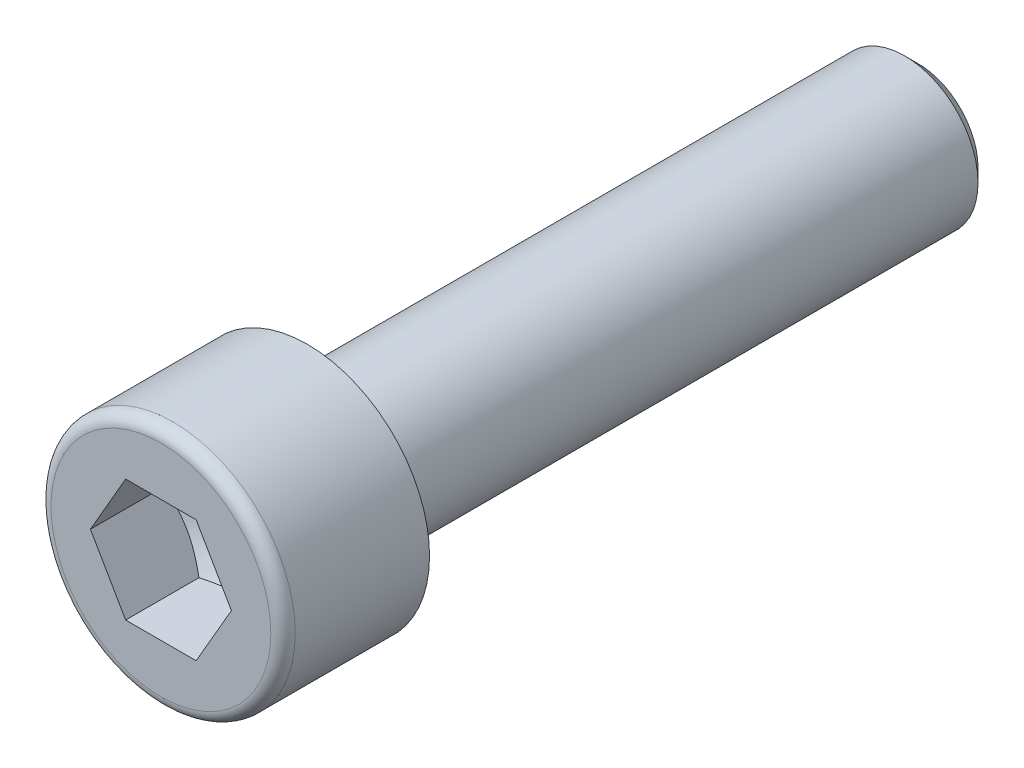
ISO-10303-21;
HEADER;
FILE_DESCRIPTION(('STEP AP214'),'2;1');
FILE_NAME('part.step','',(''),(''),'','','');
FILE_SCHEMA(('AUTOMOTIVE_DESIGN { 1 0 10303 214 1 1 1 1 }'));
ENDSEC;
DATA;
#1=APPLICATION_CONTEXT('core data for automotive mechanical design processes');
#2=APPLICATION_PROTOCOL_DEFINITION('international standard','automotive_design',2000,#1);
#3=PRODUCT_CONTEXT('',#1,'mechanical');
#4=PRODUCT('Part','Part','',(#3));
#5=PRODUCT_RELATED_PRODUCT_CATEGORY('part','',(#4));
#6=PRODUCT_DEFINITION_FORMATION('','',#4);
#7=PRODUCT_DEFINITION_CONTEXT('part definition',#1,'design');
#8=PRODUCT_DEFINITION('design','',#6,#7);
#9=PRODUCT_DEFINITION_SHAPE('','',#8);
#10=(LENGTH_UNIT() NAMED_UNIT(*) SI_UNIT(.MILLI.,.METRE.));
#11=(NAMED_UNIT(*) PLANE_ANGLE_UNIT() SI_UNIT($,.RADIAN.));
#12=(NAMED_UNIT(*) SI_UNIT($,.STERADIAN.) SOLID_ANGLE_UNIT());
#13=UNCERTAINTY_MEASURE_WITH_UNIT(LENGTH_MEASURE(1.E-05),#10,'distance_accuracy_value','');
#14=(GEOMETRIC_REPRESENTATION_CONTEXT(3) GLOBAL_UNCERTAINTY_ASSIGNED_CONTEXT((#13)) GLOBAL_UNIT_ASSIGNED_CONTEXT((#10,
#11,#12)) REPRESENTATION_CONTEXT('',''));
#15=CARTESIAN_POINT('',(0.,0.,0.));
#16=DIRECTION('',(0.,0.,1.));
#17=DIRECTION('',(1.,0.,0.));
#18=AXIS2_PLACEMENT_3D('',#15,#16,#17);
#19=CARTESIAN_POINT('',(0.,4.5,6.));
#20=DIRECTION('',(0.,0.,-1.));
#21=DIRECTION('',(-1.,0.,0.));
#22=AXIS2_PLACEMENT_3D('',#19,#20,#21);
#23=PLANE('',#22);
#24=CARTESIAN_POINT('',(0.,0.,6.));
#25=DIRECTION('',(0.,0.,1.));
#26=DIRECTION('',(1.,0.,0.));
#27=AXIS2_PLACEMENT_3D('',#24,#25,#26);
#28=CIRCLE('',#27,4.5);
#29=CARTESIAN_POINT('',(4.5,0.,6.));
#30=VERTEX_POINT('',#29);
#31=EDGE_CURVE('E124',#30,#30,#28,.T.);
#32=ORIENTED_EDGE('',*,*,#31,.T.);
#33=EDGE_LOOP('',(#32));
#34=FACE_BOUND('',#33,.T.);
#35=DIRECTION('',(0.5,-0.866025403784439,0.));
#36=VECTOR('',#35,1.);
#37=CARTESIAN_POINT('',(1.443375,2.49999883437473,6.));
#38=LINE('',#37,#36);
#39=CARTESIAN_POINT('',(1.443375,2.49999883437473,6.));
#40=VERTEX_POINT('',#39);
#41=CARTESIAN_POINT('',(2.88675,0.,6.));
#42=VERTEX_POINT('',#41);
#43=EDGE_CURVE('E30',#40,#42,#38,.T.);
#44=ORIENTED_EDGE('',*,*,#43,.T.);
#45=DIRECTION('',(-0.5,-0.866025403784439,0.));
#46=VECTOR('',#45,1.);
#47=CARTESIAN_POINT('',(2.88675,0.,6.));
#48=LINE('',#47,#46);
#49=CARTESIAN_POINT('',(1.443375,-2.49999883437473,6.));
#50=VERTEX_POINT('',#49);
#51=EDGE_CURVE('E171',#42,#50,#48,.T.);
#52=ORIENTED_EDGE('',*,*,#51,.T.);
#53=DIRECTION('',(-1.,0.,0.));
#54=VECTOR('',#53,1.);
#55=CARTESIAN_POINT('',(1.443375,-2.49999883437473,6.));
#56=LINE('',#55,#54);
#57=CARTESIAN_POINT('',(-1.443375,-2.49999883437473,6.));
#58=VERTEX_POINT('',#57);
#59=EDGE_CURVE('E176',#50,#58,#56,.T.);
#60=ORIENTED_EDGE('',*,*,#59,.T.);
#61=DIRECTION('',(-0.5,0.866025403784439,0.));
#62=VECTOR('',#61,1.);
#63=CARTESIAN_POINT('',(-1.443375,-2.49999883437473,6.));
#64=LINE('',#63,#62);
#65=CARTESIAN_POINT('',(-2.88675,0.,6.));
#66=VERTEX_POINT('',#65);
#67=EDGE_CURVE('E180',#58,#66,#64,.T.);
#68=ORIENTED_EDGE('',*,*,#67,.T.);
#69=DIRECTION('',(0.5,0.866025403784439,0.));
#70=VECTOR('',#69,1.);
#71=CARTESIAN_POINT('',(-2.88675,0.,6.));
#72=LINE('',#71,#70);
#73=CARTESIAN_POINT('',(-1.443375,2.49999883437473,6.));
#74=VERTEX_POINT('',#73);
#75=EDGE_CURVE('E102',#66,#74,#72,.T.);
#76=ORIENTED_EDGE('',*,*,#75,.T.);
#77=DIRECTION('',(1.,0.,0.));
#78=VECTOR('',#77,1.);
#79=CARTESIAN_POINT('',(-1.443375,2.49999883437473,6.));
#80=LINE('',#79,#78);
#81=EDGE_CURVE('E93',#74,#40,#80,.T.);
#82=ORIENTED_EDGE('',*,*,#81,.T.);
#83=EDGE_LOOP('',(#44,#52,#60,#68,#76,#82));
#84=FACE_BOUND('',#83,.T.);
#85=ADVANCED_FACE('F15',(#34,#84),#23,.F.);
#86=CARTESIAN_POINT('',(0.,0.,0.));
#87=DIRECTION('',(0.,0.,1.));
#88=DIRECTION('',(1.,0.,0.));
#89=AXIS2_PLACEMENT_3D('',#86,#87,#88);
#90=PLANE('',#89);
#91=CARTESIAN_POINT('',(0.,0.,0.));
#92=DIRECTION('',(0.,0.,1.));
#93=DIRECTION('',(1.,0.,0.));
#94=AXIS2_PLACEMENT_3D('',#91,#92,#93);
#95=CIRCLE('',#94,5.);
#96=CARTESIAN_POINT('',(5.,0.,0.));
#97=VERTEX_POINT('',#96);
#98=EDGE_CURVE('E23',#97,#97,#95,.T.);
#99=ORIENTED_EDGE('',*,*,#98,.F.);
#100=EDGE_LOOP('',(#99));
#101=FACE_BOUND('',#100,.T.);
#102=CARTESIAN_POINT('',(0.,0.,0.));
#103=DIRECTION('',(0.,0.,1.));
#104=DIRECTION('',(1.,0.,0.));
#105=AXIS2_PLACEMENT_3D('',#102,#103,#104);
#106=CIRCLE('',#105,3.);
#107=CARTESIAN_POINT('',(3.,0.,0.));
#108=VERTEX_POINT('',#107);
#109=EDGE_CURVE('E10',#108,#108,#106,.F.);
#110=ORIENTED_EDGE('',*,*,#109,.F.);
#111=EDGE_LOOP('',(#110));
#112=FACE_BOUND('',#111,.T.);
#113=ADVANCED_FACE('F139',(#101,#112),#90,.F.);
#114=CARTESIAN_POINT('',(0.,0.,6.));
#115=DIRECTION('',(0.,0.,1.));
#116=DIRECTION('',(1.,0.,0.));
#117=AXIS2_PLACEMENT_3D('',#114,#115,#116);
#118=CYLINDRICAL_SURFACE('',#117,5.);
#119=CARTESIAN_POINT('',(0.,0.,5.5));
#120=DIRECTION('',(0.,0.,1.));
#121=DIRECTION('',(1.,0.,0.));
#122=AXIS2_PLACEMENT_3D('',#119,#120,#121);
#123=CIRCLE('',#122,5.);
#124=CARTESIAN_POINT('',(5.,0.,5.5));
#125=VERTEX_POINT('',#124);
#126=EDGE_CURVE('E128',#125,#125,#123,.T.);
#127=ORIENTED_EDGE('',*,*,#126,.F.);
#128=EDGE_LOOP('',(#127));
#129=FACE_BOUND('',#128,.T.);
#130=ORIENTED_EDGE('',*,*,#98,.T.);
#131=EDGE_LOOP('',(#130));
#132=FACE_BOUND('',#131,.T.);
#133=ADVANCED_FACE('F137',(#129,#132),#118,.T.);
#134=CARTESIAN_POINT('',(0.,0.,5.5));
#135=DIRECTION('',(0.,0.,1.));
#136=DIRECTION('',(1.,0.,0.));
#137=AXIS2_PLACEMENT_3D('',#134,#135,#136);
#138=TOROIDAL_SURFACE('',#137,4.5,0.5);
#139=ORIENTED_EDGE('',*,*,#31,.F.);
#140=EDGE_LOOP('',(#139));
#141=FACE_BOUND('',#140,.T.);
#142=ORIENTED_EDGE('',*,*,#126,.T.);
#143=EDGE_LOOP('',(#142));
#144=FACE_BOUND('',#143,.T.);
#145=ADVANCED_FACE('F147',(#141,#144),#138,.T.);
#146=CARTESIAN_POINT('',(0.,0.,0.));
#147=DIRECTION('',(0.,0.,1.));
#148=DIRECTION('',(1.,0.,0.));
#149=AXIS2_PLACEMENT_3D('',#146,#147,#148);
#150=CYLINDRICAL_SURFACE('',#149,3.);
#151=CARTESIAN_POINT('',(0.,0.,-24.45875));
#152=DIRECTION('',(0.,0.,1.));
#153=DIRECTION('',(1.,0.,0.));
#154=AXIS2_PLACEMENT_3D('',#151,#152,#153);
#155=CIRCLE('',#154,3.);
#156=CARTESIAN_POINT('',(3.,0.,-24.45875));
#157=VERTEX_POINT('',#156);
#158=EDGE_CURVE('E116',#157,#157,#155,.T.);
#159=ORIENTED_EDGE('',*,*,#158,.T.);
#160=EDGE_LOOP('',(#159));
#161=FACE_BOUND('',#160,.T.);
#162=ORIENTED_EDGE('',*,*,#109,.T.);
#163=EDGE_LOOP('',(#162));
#164=FACE_BOUND('',#163,.T.);
#165=ADVANCED_FACE('F144',(#161,#164),#150,.T.);
#166=CARTESIAN_POINT('',(0.,0.,-25.));
#167=DIRECTION('',(0.,0.,1.));
#168=DIRECTION('',(1.,0.,0.));
#169=AXIS2_PLACEMENT_3D('',#166,#167,#168);
#170=PLANE('',#169);
#171=CARTESIAN_POINT('',(0.,0.,-25.));
#172=DIRECTION('',(0.,0.,1.));
#173=DIRECTION('',(1.,0.,0.));
#174=AXIS2_PLACEMENT_3D('',#171,#172,#173);
#175=CIRCLE('',#174,2.45875);
#176=CARTESIAN_POINT('',(2.45875,0.,-25.));
#177=VERTEX_POINT('',#176);
#178=EDGE_CURVE('E120',#177,#177,#175,.T.);
#179=ORIENTED_EDGE('',*,*,#178,.F.);
#180=EDGE_LOOP('',(#179));
#181=FACE_BOUND('',#180,.T.);
#182=ADVANCED_FACE('F146',(#181),#170,.F.);
#183=CARTESIAN_POINT('',(0.,0.,-25.));
#184=DIRECTION('',(0.,0.,1.));
#185=DIRECTION('',(1.,0.,0.));
#186=AXIS2_PLACEMENT_3D('',#183,#184,#185);
#187=CONICAL_SURFACE('',#186,2.45875,0.785398163397453);
#188=ORIENTED_EDGE('',*,*,#158,.F.);
#189=EDGE_LOOP('',(#188));
#190=FACE_BOUND('',#189,.T.);
#191=ORIENTED_EDGE('',*,*,#178,.T.);
#192=EDGE_LOOP('',(#191));
#193=FACE_BOUND('',#192,.T.);
#194=ADVANCED_FACE('F155',(#190,#193),#187,.T.);
#195=CARTESIAN_POINT('',(1.443375,2.49999883437473,1.33333411041685));
#196=DIRECTION('',(-0.866025403784439,-0.5,0.));
#197=DIRECTION('',(-0.5,0.866025403784438,0.));
#198=AXIS2_PLACEMENT_3D('',#195,#196,#197);
#199=PLANE('',#198);
#200=DIRECTION('',(0.,0.,1.));
#201=VECTOR('',#200,1.);
#202=CARTESIAN_POINT('',(2.88675,0.,1.33333411041685));
#203=LINE('',#202,#201);
#204=CARTESIAN_POINT('',(2.88675,0.,3.));
#205=VERTEX_POINT('',#204);
#206=EDGE_CURVE('E114',#205,#42,#203,.T.);
#207=ORIENTED_EDGE('',*,*,#206,.T.);
#208=ORIENTED_EDGE('',*,*,#43,.F.);
#209=DIRECTION('',(0.,0.,1.));
#210=VECTOR('',#209,1.);
#211=CARTESIAN_POINT('',(1.443375,2.49999883437473,1.33333411041685));
#212=LINE('',#211,#210);
#213=CARTESIAN_POINT('',(1.443375,2.49999883437473,3.));
#214=VERTEX_POINT('',#213);
#215=EDGE_CURVE('E86',#214,#40,#212,.T.);
#216=ORIENTED_EDGE('',*,*,#215,.F.);
#217=CARTESIAN_POINT('',(2.88675115470054,-2.E-06,3.00000066666707));
#218=CARTESIAN_POINT('',(2.82332354535897,0.109857841982227,2.96337006039726));
#219=CARTESIAN_POINT('',(2.75934842983882,0.220665992483223,2.93005643273496));
#220=CARTESIAN_POINT('',(2.63029051087885,0.444200865240994,2.87190847700775));
#221=CARTESIAN_POINT('',(2.56520541506427,0.556931558007335,2.84709471727335));
#222=CARTESIAN_POINT('',(2.4358417909861,0.78099592756197,2.8084702850323));
#223=CARTESIAN_POINT('',(2.37158316147789,0.892295138694932,2.79440251599447));
#224=CARTESIAN_POINT('',(2.24276369983448,1.11541699126498,2.77761163079658));
#225=CARTESIAN_POINT('',(2.17820333560637,1.22723882226323,2.77487460704407));
#226=CARTESIAN_POINT('',(2.05757906871724,1.43616618114094,2.7805828840092));
#227=CARTESIAN_POINT('',(2.00149706603362,1.53330305917919,2.78762661346734));
#228=CARTESIAN_POINT('',(1.88969841687931,1.72694399973201,2.8099466525033));
#229=CARTESIAN_POINT('',(1.83398215680598,1.82344739298676,2.82523057920943));
#230=CARTESIAN_POINT('',(1.72195318911858,2.01748725694082,2.86343746342627));
#231=CARTESIAN_POINT('',(1.66565465323697,2.1149991814795,2.88652230296935));
#232=CARTESIAN_POINT('',(1.55389703460282,2.30856905508676,2.93891513912548));
#233=CARTESIAN_POINT('',(1.49843652119396,2.40462948212476,2.96821083329068));
#234=CARTESIAN_POINT('',(1.44337384529946,2.50000083437473,3.00000066666707));
#235=B_SPLINE_CURVE_WITH_KNOTS('',3,(#217,#218,#219,#220,#221,#222,#223,#224,#225,#226,#227,
#228,#229,#230,#231,#232,#233,#234),.UNSPECIFIED.,.F.,.F.,(4,2,2,2,2,2,2,2,4),(0.,
0.396269987805477,0.793492221888839,1.1808844206854,1.56780098500208,1.90463546712439,
2.24178184973835,2.58640455505215,2.93035090593904),.UNSPECIFIED.);
#236=EDGE_CURVE('E78',#205,#214,#235,.T.);
#237=ORIENTED_EDGE('',*,*,#236,.F.);
#238=EDGE_LOOP('',(#207,#208,#216,#237));
#239=FACE_BOUND('',#238,.T.);
#240=ADVANCED_FACE('F87',(#239),#199,.T.);
#241=CARTESIAN_POINT('',(2.88675,0.,1.33333411041685));
#242=DIRECTION('',(-0.866025403784439,0.5,0.));
#243=DIRECTION('',(0.5,0.866025403784439,0.));
#244=AXIS2_PLACEMENT_3D('',#241,#242,#243);
#245=PLANE('',#244);
#246=DIRECTION('',(0.,0.,1.));
#247=VECTOR('',#246,1.);
#248=CARTESIAN_POINT('',(1.443375,-2.49999883437473,1.33333411041685));
#249=LINE('',#248,#247);
#250=CARTESIAN_POINT('',(1.443375,-2.49999883437473,3.));
#251=VERTEX_POINT('',#250);
#252=EDGE_CURVE('E111',#251,#50,#249,.T.);
#253=ORIENTED_EDGE('',*,*,#252,.T.);
#254=ORIENTED_EDGE('',*,*,#51,.F.);
#255=ORIENTED_EDGE('',*,*,#206,.F.);
#256=CARTESIAN_POINT('',(1.44337384529946,-2.50000083437473,3.00000066666707));
#257=CARTESIAN_POINT('',(1.50680145464103,-2.3901409923925,2.96337006039726));
#258=CARTESIAN_POINT('',(1.57077657016118,-2.27933284189151,2.93005643273496));
#259=CARTESIAN_POINT('',(1.69983448912115,-2.05579796913373,2.87190847700775));
#260=CARTESIAN_POINT('',(1.76491958493573,-1.94306727636739,2.84709471727335));
#261=CARTESIAN_POINT('',(1.8942832090139,-1.71900290681276,2.8084702850323));
#262=CARTESIAN_POINT('',(1.95854183852211,-1.6077036956798,2.79440251599447));
#263=CARTESIAN_POINT('',(2.08736130016552,-1.38458184310974,2.77761163079658));
#264=CARTESIAN_POINT('',(2.15192166439363,-1.2727600121115,2.77487460704408));
#265=CARTESIAN_POINT('',(2.27254593128276,-1.06383265323379,2.7805828840092));
#266=CARTESIAN_POINT('',(2.32862793396638,-0.966695775195541,2.78762661346734));
#267=CARTESIAN_POINT('',(2.44042658312069,-0.773054834642715,2.8099466525033));
#268=CARTESIAN_POINT('',(2.49614284319403,-0.676551441387972,2.82523057920943));
#269=CARTESIAN_POINT('',(2.60817181088142,-0.482511577433911,2.86343746342627));
#270=CARTESIAN_POINT('',(2.66447034676303,-0.384999652895224,2.88652230296935));
#271=CARTESIAN_POINT('',(2.77622796539718,-0.191429779287974,2.93891513912548));
#272=CARTESIAN_POINT('',(2.83168847880604,-0.0953693522499732,2.96821083329068));
#273=CARTESIAN_POINT('',(2.88675115470054,2.00000000025213E-06,3.00000066666707));
#274=B_SPLINE_CURVE_WITH_KNOTS('',3,(#256,#257,#258,#259,#260,#261,#262,#263,#264,#265,#266,
#267,#268,#269,#270,#271,#272,#273),.UNSPECIFIED.,.F.,.F.,(4,2,2,2,2,2,2,2,4),(0.,
0.396269987805478,0.79349222188884,1.1808844206854,1.56780098500208,1.90463546712439,
2.24178184973836,2.58640455505215,2.93035090593904),.UNSPECIFIED.);
#275=EDGE_CURVE('E82',#251,#205,#274,.T.);
#276=ORIENTED_EDGE('',*,*,#275,.F.);
#277=EDGE_LOOP('',(#253,#254,#255,#276));
#278=FACE_BOUND('',#277,.T.);
#279=ADVANCED_FACE('F236',(#278),#245,.T.);
#280=CARTESIAN_POINT('',(1.443375,-2.49999883437473,1.33333411041685));
#281=DIRECTION('',(0.,1.,0.));
#282=DIRECTION('',(1.,0.,0.));
#283=AXIS2_PLACEMENT_3D('',#280,#281,#282);
#284=PLANE('',#283);
#285=DIRECTION('',(0.,0.,1.));
#286=VECTOR('',#285,1.);
#287=CARTESIAN_POINT('',(-1.443375,-2.49999883437473,1.33333411041685));
#288=LINE('',#287,#286);
#289=CARTESIAN_POINT('',(-1.443375,-2.49999883437473,3.));
#290=VERTEX_POINT('',#289);
#291=EDGE_CURVE('E108',#290,#58,#288,.T.);
#292=ORIENTED_EDGE('',*,*,#291,.T.);
#293=ORIENTED_EDGE('',*,*,#59,.F.);
#294=ORIENTED_EDGE('',*,*,#252,.F.);
#295=CARTESIAN_POINT('',(-3.73786106214979,-2.49999883437473,3.92958778907324));
#296=CARTESIAN_POINT('',(-3.62990250335969,-2.49999883437473,3.87779335774325));
#297=CARTESIAN_POINT('',(-3.52168094276801,-2.49999883437473,3.82653690477121));
#298=CARTESIAN_POINT('',(-3.30457164494513,-2.49999883437473,3.72540514162743));
#299=CARTESIAN_POINT('',(-3.19568379207403,-2.49999883437473,3.67553008001432));
#300=CARTESIAN_POINT('',(-2.9764774054262,-2.49999883437473,3.57718765766728));
#301=CARTESIAN_POINT('',(-2.86615419981139,-2.49999883437473,3.52873067133896));
#302=CARTESIAN_POINT('',(-2.64458202847932,-2.49999883437473,3.4339896311619));
#303=CARTESIAN_POINT('',(-2.53333311125245,-2.49999883437473,3.38770546433014));
#304=CARTESIAN_POINT('',(-2.30680205819545,-2.49999883437473,3.2967100755852));
#305=CARTESIAN_POINT('',(-2.19149052050016,-2.49999883437473,3.2520716190807));
#306=CARTESIAN_POINT('',(-1.95947266398433,-2.49999883437473,3.1665059843482));
#307=CARTESIAN_POINT('',(-1.84276618516189,-2.49999883437473,3.12557923657333));
#308=CARTESIAN_POINT('',(-1.60804233924781,-2.49999883437473,3.04860739009266));
#309=CARTESIAN_POINT('',(-1.49002871456052,-2.49999883437473,3.01255100191558));
#310=CARTESIAN_POINT('',(-1.25231014409633,-2.49999883437473,2.94655294839667));
#311=CARTESIAN_POINT('',(-1.13260562628878,-2.49999883437473,2.91660976441946));
#312=CARTESIAN_POINT('',(-0.891754624847682,-2.49999883437473,2.86443431611274));
#313=CARTESIAN_POINT('',(-0.770611640017906,-2.49999883437473,2.84218621451804));
#314=CARTESIAN_POINT('',(-0.526970339246118,-2.49999883437473,2.8068577746921));
#315=CARTESIAN_POINT('',(-0.404472115461951,-2.49999883437473,2.79377681692952));
#316=CARTESIAN_POINT('',(-0.160266323051493,-2.49999883437473,2.7779963214066));
#317=CARTESIAN_POINT('',(-0.0385668667227562,-2.49999883437473,2.77517427588141));
#318=CARTESIAN_POINT('',(0.204641816788917,-2.49999883437473,2.77983589012324));
#319=CARTESIAN_POINT('',(0.326151031726512,-2.49999883437473,2.78732018801759));
#320=CARTESIAN_POINT('',(0.536550258909014,-2.49999883437473,2.80869871352845));
#321=CARTESIAN_POINT('',(0.62567290534766,-2.49999883437473,2.82040889034712));
#322=CARTESIAN_POINT('',(0.80317291802574,-2.49999883437473,2.84856827951529));
#323=CARTESIAN_POINT('',(0.89155015258231,-2.49999883437473,2.86501831186796));
#324=CARTESIAN_POINT('',(1.15551819105506,-2.49999883437473,2.920608175745));
#325=CARTESIAN_POINT('',(1.32980784141715,-2.49999883437473,2.96597208143992));
#326=CARTESIAN_POINT('',(1.59042319619559,-2.49999883437473,3.04347409361569));
#327=CARTESIAN_POINT('',(1.6781227038712,-2.49999883437473,3.07124565241289));
#328=CARTESIAN_POINT('',(1.85261386594625,-2.49999883437473,3.12935698644029));
#329=CARTESIAN_POINT('',(1.93940604944137,-2.49999883437473,3.15969515890171));
#330=CARTESIAN_POINT('',(2.11219208096506,-2.49999883437473,3.2225001255257));
#331=CARTESIAN_POINT('',(2.19818607085344,-2.49999883437473,3.25496653284332));
#332=CARTESIAN_POINT('',(2.36949689943691,-2.49999883437473,3.32167630023758));
#333=CARTESIAN_POINT('',(2.4548136208992,-2.49999883437473,3.35591996053755));
#334=CARTESIAN_POINT('',(2.6725866434786,-2.49999883437473,3.44552247380957));
#335=CARTESIAN_POINT('',(2.80460719164756,-2.49999883437473,3.50193903020824));
#336=CARTESIAN_POINT('',(3.06745887456859,-2.49999883437473,3.61748626069377));
#337=CARTESIAN_POINT('',(3.19828991933625,-2.49999883437473,3.6766171381022));
#338=CARTESIAN_POINT('',(3.4590085358823,-2.49999883437473,3.79697662160321));
#339=CARTESIAN_POINT('',(3.58889593921384,-2.49999883437473,3.85820559158554));
#340=CARTESIAN_POINT('',(3.84788850349047,-2.49999883437473,3.98229871528446));
#341=CARTESIAN_POINT('',(3.97699364696087,-2.49999883437473,4.04516290536492));
#342=CARTESIAN_POINT('',(4.36366797006391,-2.49999883437473,4.23583166126771));
#343=CARTESIAN_POINT('',(4.62028446759073,-2.49999883437473,4.36556642178983));
#344=CARTESIAN_POINT('',(5.13176042686128,-2.49999883437473,4.62835386929467));
#345=CARTESIAN_POINT('',(5.38662010673858,-2.49999883437473,4.76140613453321));
#346=CARTESIAN_POINT('',(5.87112459117811,-2.49999883437473,5.01714634418064));
#347=CARTESIAN_POINT('',(6.10087887005075,-2.49999883437473,5.13962722061171));
#348=CARTESIAN_POINT('',(6.55964844430519,-2.49999883437473,5.38598343470431));
#349=CARTESIAN_POINT('',(6.78866371193351,-2.49999883437473,5.50985882397014));
#350=CARTESIAN_POINT('',(7.2455430452267,-2.49999883437473,5.75833902928913));
#351=CARTESIAN_POINT('',(7.47340855738404,-2.49999883437473,5.88294118863516));
#352=CARTESIAN_POINT('',(7.9286788902648,-2.49999883437473,6.13295649095833));
#353=CARTESIAN_POINT('',(8.156083734473,-2.49999883437473,6.25836959115399));
#354=CARTESIAN_POINT('',(8.38332307978598,-2.49999883437473,6.38407993098458));
#355=B_SPLINE_CURVE_WITH_KNOTS('',3,(#295,#296,#297,#298,#299,#300,#301,#302,#303,#304,#305,
#306,#307,#308,#309,#310,#311,#312,#313,#314,#315,#316,#317,#318,#319,#320,#321,#322,#323,#324,
#325,#326,#327,#328,#329,#330,#331,#332,#333,#334,#335,#336,#337,#338,#339,#340,#341,#342,#343,
#344,#345,#346,#347,#348,#349,#350,#351,#352,#353,#354),.UNSPECIFIED.,.F.,.F.,(4,2,2,2,2,2,2,2,
2,2,2,2,2,2,2,2,2,2,2,2,2,2,2,2,2,2,2,2,2,4),(0.,0.359225681612437,0.718515585501186,
1.07998495471943,1.44143550726446,1.81233642992121,2.18328031172541,2.553349025072,
2.92332569419794,3.29253631826214,3.66172198803058,4.02648423639168,4.39126907037958,
4.66080188357842,4.93038135444365,5.4699536049164,5.74590907322745,6.02169347043866,
6.29742787713709,6.57320901498075,7.00387400010299,7.43457129784687,7.86534367692857,
8.29612564369277,9.15872160396268,10.0212084586034,10.8022892260896,11.5833989933082,
12.3625220011586,13.1416042361018),.UNSPECIFIED.);
#356=EDGE_CURVE('E224',#290,#251,#355,.T.);
#357=ORIENTED_EDGE('',*,*,#356,.F.);
#358=EDGE_LOOP('',(#292,#293,#294,#357));
#359=FACE_BOUND('',#358,.T.);
#360=ADVANCED_FACE('F231',(#359),#284,.T.);
#361=CARTESIAN_POINT('',(-1.443375,-2.49999883437473,1.33333411041685));
#362=DIRECTION('',(0.866025403784439,0.5,0.));
#363=DIRECTION('',(0.5,-0.866025403784439,0.));
#364=AXIS2_PLACEMENT_3D('',#361,#362,#363);
#365=PLANE('',#364);
#366=DIRECTION('',(0.,0.,1.));
#367=VECTOR('',#366,1.);
#368=CARTESIAN_POINT('',(-2.88675,0.,1.33333411041685));
#369=LINE('',#368,#367);
#370=CARTESIAN_POINT('',(-2.88675,0.,3.));
#371=VERTEX_POINT('',#370);
#372=EDGE_CURVE('E99',#371,#66,#369,.T.);
#373=ORIENTED_EDGE('',*,*,#372,.T.);
#374=ORIENTED_EDGE('',*,*,#67,.F.);
#375=ORIENTED_EDGE('',*,*,#291,.F.);
#376=CARTESIAN_POINT('',(-2.88675115470054,2.00000000083267E-06,3.00000066666707));
#377=CARTESIAN_POINT('',(-2.82332354535897,-0.109857841982226,2.96337006039727));
#378=CARTESIAN_POINT('',(-2.75934842983882,-0.220665992483222,2.93005643273496));
#379=CARTESIAN_POINT('',(-2.63029051087885,-0.444200865240993,2.87190847700775));
#380=CARTESIAN_POINT('',(-2.56520541506427,-0.556931558007334,2.84709471727335));
#381=CARTESIAN_POINT('',(-2.4358417909861,-0.780995927561968,2.8084702850323));
#382=CARTESIAN_POINT('',(-2.37158316147789,-0.89229513869493,2.79440251599447));
#383=CARTESIAN_POINT('',(-2.24276369983448,-1.11541699126498,2.77761163079658));
#384=CARTESIAN_POINT('',(-2.17820333560637,-1.22723882226323,2.77487460704408));
#385=CARTESIAN_POINT('',(-2.05757906871724,-1.43616618114094,2.7805828840092));
#386=CARTESIAN_POINT('',(-2.00149706603362,-1.53330305917919,2.78762661346734));
#387=CARTESIAN_POINT('',(-1.88969841687931,-1.72694399973201,2.8099466525033));
#388=CARTESIAN_POINT('',(-1.83398215680598,-1.82344739298676,2.82523057920943));
#389=CARTESIAN_POINT('',(-1.72195318911858,-2.01748725694082,2.86343746342627));
#390=CARTESIAN_POINT('',(-1.66565465323697,-2.1149991814795,2.88652230296935));
#391=CARTESIAN_POINT('',(-1.55389703460282,-2.30856905508676,2.93891513912548));
#392=CARTESIAN_POINT('',(-1.49843652119396,-2.40462948212476,2.96821083329068));
#393=CARTESIAN_POINT('',(-1.44337384529946,-2.50000083437473,3.00000066666707));
#394=B_SPLINE_CURVE_WITH_KNOTS('',3,(#376,#377,#378,#379,#380,#381,#382,#383,#384,#385,#386,
#387,#388,#389,#390,#391,#392,#393),.UNSPECIFIED.,.F.,.F.,(4,2,2,2,2,2,2,2,4),(0.,
0.396269987805478,0.793492221888839,1.1808844206854,1.56780098500208,1.90463546712439,
2.24178184973836,2.58640455505215,2.93035090593905),.UNSPECIFIED.);
#395=EDGE_CURVE('E217',#371,#290,#394,.T.);
#396=ORIENTED_EDGE('',*,*,#395,.F.);
#397=EDGE_LOOP('',(#373,#374,#375,#396));
#398=FACE_BOUND('',#397,.T.);
#399=ADVANCED_FACE('F200',(#398),#365,.T.);
#400=CARTESIAN_POINT('',(-2.88675,0.,1.33333411041685));
#401=DIRECTION('',(0.866025403784439,-0.5,0.));
#402=DIRECTION('',(-0.5,-0.866025403784439,0.));
#403=AXIS2_PLACEMENT_3D('',#400,#401,#402);
#404=PLANE('',#403);
#405=DIRECTION('',(0.,0.,1.));
#406=VECTOR('',#405,1.);
#407=CARTESIAN_POINT('',(-1.443375,2.49999883437473,1.33333411041685));
#408=LINE('',#407,#406);
#409=CARTESIAN_POINT('',(-1.443375,2.49999883437473,3.));
#410=VERTEX_POINT('',#409);
#411=EDGE_CURVE('E92',#410,#74,#408,.T.);
#412=ORIENTED_EDGE('',*,*,#411,.T.);
#413=ORIENTED_EDGE('',*,*,#75,.F.);
#414=ORIENTED_EDGE('',*,*,#372,.F.);
#415=CARTESIAN_POINT('',(-1.44337384529946,2.50000083437473,3.00000066666707));
#416=CARTESIAN_POINT('',(-1.50680145464103,2.3901409923925,2.96337006039726));
#417=CARTESIAN_POINT('',(-1.57077657016118,2.27933284189151,2.93005643273496));
#418=CARTESIAN_POINT('',(-1.69983448912115,2.05579796913373,2.87190847700775));
#419=CARTESIAN_POINT('',(-1.76491958493573,1.94306727636739,2.84709471727335));
#420=CARTESIAN_POINT('',(-1.8942832090139,1.71900290681276,2.8084702850323));
#421=CARTESIAN_POINT('',(-1.95854183852211,1.6077036956798,2.79440251599447));
#422=CARTESIAN_POINT('',(-2.08736130016552,1.38458184310974,2.77761163079658));
#423=CARTESIAN_POINT('',(-2.15192166439363,1.2727600121115,2.77487460704408));
#424=CARTESIAN_POINT('',(-2.27254593128276,1.06383265323379,2.7805828840092));
#425=CARTESIAN_POINT('',(-2.32862793396638,0.966695775195541,2.78762661346734));
#426=CARTESIAN_POINT('',(-2.44042658312069,0.773054834642715,2.8099466525033));
#427=CARTESIAN_POINT('',(-2.49614284319402,0.676551441387972,2.82523057920943));
#428=CARTESIAN_POINT('',(-2.60817181088142,0.482511577433911,2.86343746342627));
#429=CARTESIAN_POINT('',(-2.66447034676303,0.384999652895224,2.88652230296935));
#430=CARTESIAN_POINT('',(-2.77622796539718,0.191429779287974,2.93891513912548));
#431=CARTESIAN_POINT('',(-2.83168847880604,0.0953693522499737,2.96821083329068));
#432=CARTESIAN_POINT('',(-2.88675115470054,-1.9999999995853E-06,3.00000066666707));
#433=B_SPLINE_CURVE_WITH_KNOTS('',3,(#415,#416,#417,#418,#419,#420,#421,#422,#423,#424,#425,
#426,#427,#428,#429,#430,#431,#432),.UNSPECIFIED.,.F.,.F.,(4,2,2,2,2,2,2,2,4),(0.,
0.396269987805478,0.79349222188884,1.1808844206854,1.56780098500208,1.90463546712439,
2.24178184973835,2.58640455505215,2.93035090593904),.UNSPECIFIED.);
#434=EDGE_CURVE('E38',#410,#371,#433,.T.);
#435=ORIENTED_EDGE('',*,*,#434,.F.);
#436=EDGE_LOOP('',(#412,#413,#414,#435));
#437=FACE_BOUND('',#436,.T.);
#438=ADVANCED_FACE('F194',(#437),#404,.T.);
#439=CARTESIAN_POINT('',(-1.443375,2.49999883437473,1.33333411041685));
#440=DIRECTION('',(0.,-1.,0.));
#441=DIRECTION('',(-1.,0.,0.));
#442=AXIS2_PLACEMENT_3D('',#439,#440,#441);
#443=PLANE('',#442);
#444=ORIENTED_EDGE('',*,*,#215,.T.);
#445=ORIENTED_EDGE('',*,*,#81,.F.);
#446=ORIENTED_EDGE('',*,*,#411,.F.);
#447=CARTESIAN_POINT('',(-3.73786106214979,2.49999883437473,3.92958778907324));
#448=CARTESIAN_POINT('',(-3.62990250335969,2.49999883437473,3.87779335774325));
#449=CARTESIAN_POINT('',(-3.52168094276801,2.49999883437473,3.82653690477121));
#450=CARTESIAN_POINT('',(-3.30457164494513,2.49999883437473,3.72540514162743));
#451=CARTESIAN_POINT('',(-3.19568379207404,2.49999883437473,3.67553008001432));
#452=CARTESIAN_POINT('',(-2.9764774054262,2.49999883437473,3.57718765766728));
#453=CARTESIAN_POINT('',(-2.86615419981139,2.49999883437473,3.52873067133896));
#454=CARTESIAN_POINT('',(-2.64458202847932,2.49999883437473,3.4339896311619));
#455=CARTESIAN_POINT('',(-2.53333311125245,2.49999883437473,3.38770546433014));
#456=CARTESIAN_POINT('',(-2.30680205819545,2.49999883437473,3.2967100755852));
#457=CARTESIAN_POINT('',(-2.19149052050016,2.49999883437473,3.2520716190807));
#458=CARTESIAN_POINT('',(-1.95947266398433,2.49999883437473,3.1665059843482));
#459=CARTESIAN_POINT('',(-1.8427661851619,2.49999883437473,3.12557923657333));
#460=CARTESIAN_POINT('',(-1.60804233924781,2.49999883437473,3.04860739009266));
#461=CARTESIAN_POINT('',(-1.49002871456052,2.49999883437473,3.01255100191558));
#462=CARTESIAN_POINT('',(-1.25231014409633,2.49999883437473,2.94655294839667));
#463=CARTESIAN_POINT('',(-1.13260562628879,2.49999883437473,2.91660976441946));
#464=CARTESIAN_POINT('',(-0.891754624847686,2.49999883437473,2.86443431611274));
#465=CARTESIAN_POINT('',(-0.770611640017909,2.49999883437473,2.84218621451804));
#466=CARTESIAN_POINT('',(-0.526970339246121,2.49999883437473,2.8068577746921));
#467=CARTESIAN_POINT('',(-0.404472115461954,2.49999883437473,2.79377681692952));
#468=CARTESIAN_POINT('',(-0.160266323051496,2.49999883437473,2.7779963214066));
#469=CARTESIAN_POINT('',(-0.0385668667227587,2.49999883437473,2.77517427588141));
#470=CARTESIAN_POINT('',(0.204641816788915,2.49999883437473,2.77983589012324));
#471=CARTESIAN_POINT('',(0.326151031726511,2.49999883437473,2.78732018801759));
#472=CARTESIAN_POINT('',(0.536550258909011,2.49999883437473,2.80869871352845));
#473=CARTESIAN_POINT('',(0.625672905347658,2.49999883437473,2.82040889034712));
#474=CARTESIAN_POINT('',(0.803172918025738,2.49999883437473,2.84856827951529));
#475=CARTESIAN_POINT('',(0.891550152582308,2.49999883437473,2.86501831186796));
#476=CARTESIAN_POINT('',(1.15551819105505,2.49999883437473,2.920608175745));
#477=CARTESIAN_POINT('',(1.32980784141715,2.49999883437473,2.96597208143992));
#478=CARTESIAN_POINT('',(1.59042319619558,2.49999883437473,3.04347409361569));
#479=CARTESIAN_POINT('',(1.6781227038712,2.49999883437473,3.07124565241289));
#480=CARTESIAN_POINT('',(1.85261386594624,2.49999883437473,3.12935698644029));
#481=CARTESIAN_POINT('',(1.93940604944136,2.49999883437473,3.15969515890171));
#482=CARTESIAN_POINT('',(2.11219208096505,2.49999883437473,3.2225001255257));
#483=CARTESIAN_POINT('',(2.19818607085344,2.49999883437473,3.25496653284332));
#484=CARTESIAN_POINT('',(2.36949689943691,2.49999883437473,3.32167630023758));
#485=CARTESIAN_POINT('',(2.45481362089919,2.49999883437473,3.35591996053755));
#486=CARTESIAN_POINT('',(2.6725866434786,2.49999883437473,3.44552247380957));
#487=CARTESIAN_POINT('',(2.80460719164756,2.49999883437473,3.50193903020824));
#488=CARTESIAN_POINT('',(3.06745887456859,2.49999883437473,3.61748626069377));
#489=CARTESIAN_POINT('',(3.19828991933624,2.49999883437473,3.6766171381022));
#490=CARTESIAN_POINT('',(3.45900853588229,2.49999883437473,3.79697662160321));
#491=CARTESIAN_POINT('',(3.58889593921384,2.49999883437473,3.85820559158554));
#492=CARTESIAN_POINT('',(3.84788850349046,2.49999883437473,3.98229871528446));
#493=CARTESIAN_POINT('',(3.97699364696087,2.49999883437473,4.04516290536492));
#494=CARTESIAN_POINT('',(4.3636679700639,2.49999883437473,4.23583166126771));
#495=CARTESIAN_POINT('',(4.62028446759072,2.49999883437473,4.36556642178983));
#496=CARTESIAN_POINT('',(5.13176042686127,2.49999883437473,4.62835386929467));
#497=CARTESIAN_POINT('',(5.38662010673857,2.49999883437473,4.7614061345332));
#498=CARTESIAN_POINT('',(5.8711245911781,2.49999883437473,5.01714634418064));
#499=CARTESIAN_POINT('',(6.10087887005074,2.49999883437473,5.13962722061171));
#500=CARTESIAN_POINT('',(6.55964844430518,2.49999883437473,5.38598343470431));
#501=CARTESIAN_POINT('',(6.7886637119335,2.49999883437473,5.50985882397013));
#502=CARTESIAN_POINT('',(7.24554304522669,2.49999883437473,5.75833902928913));
#503=CARTESIAN_POINT('',(7.47340855738403,2.49999883437474,5.88294118863516));
#504=CARTESIAN_POINT('',(7.92867889026479,2.49999883437474,6.13295649095833));
#505=CARTESIAN_POINT('',(8.15608373447299,2.49999883437474,6.25836959115399));
#506=CARTESIAN_POINT('',(8.38332307978597,2.49999883437473,6.38407993098458));
#507=B_SPLINE_CURVE_WITH_KNOTS('',3,(#447,#448,#449,#450,#451,#452,#453,#454,#455,#456,#457,
#458,#459,#460,#461,#462,#463,#464,#465,#466,#467,#468,#469,#470,#471,#472,#473,#474,#475,#476,
#477,#478,#479,#480,#481,#482,#483,#484,#485,#486,#487,#488,#489,#490,#491,#492,#493,#494,#495,
#496,#497,#498,#499,#500,#501,#502,#503,#504,#505,#506),.UNSPECIFIED.,.F.,.F.,(4,2,2,2,2,2,2,2,
2,2,2,2,2,2,2,2,2,2,2,2,2,2,2,2,2,2,2,2,2,4),(0.,0.359225681612436,0.718515585501185,
1.07998495471943,1.44143550726446,1.8123364299212,2.1832803117254,2.553349025072,
2.92332569419794,3.29253631826213,3.66172198803058,4.02648423639168,4.39126907037958,
4.66080188357842,4.93038135444365,5.4699536049164,5.74590907322745,6.02169347043866,
6.29742787713709,6.57320901498075,7.00387400010299,7.43457129784686,7.86534367692857,
8.29612564369276,9.15872160396267,10.0212084586034,10.8022892260895,11.5833989933082,
12.3625220011586,13.1416042361018),.UNSPECIFIED.);
#508=EDGE_CURVE('E79',#214,#410,#507,.F.);
#509=ORIENTED_EDGE('',*,*,#508,.F.);
#510=EDGE_LOOP('',(#444,#445,#446,#509));
#511=FACE_BOUND('',#510,.T.);
#512=ADVANCED_FACE('F74',(#511),#443,.T.);
#513=CARTESIAN_POINT('',(0.,0.,1.33333411041685));
#514=DIRECTION('',(0.,0.,1.));
#515=DIRECTION('',(1.,0.,0.));
#516=AXIS2_PLACEMENT_3D('',#513,#514,#515);
#517=CONICAL_SURFACE('',#516,0.,1.0471975511966);
#518=CARTESIAN_POINT('',(0.,0.,1.33333411041685));
#519=VERTEX_POINT('',#518);
#520=VERTEX_LOOP('',#519);
#521=FACE_BOUND('',#520,.T.);
#522=ORIENTED_EDGE('',*,*,#236,.T.);
#523=ORIENTED_EDGE('',*,*,#508,.T.);
#524=ORIENTED_EDGE('',*,*,#434,.T.);
#525=ORIENTED_EDGE('',*,*,#395,.T.);
#526=ORIENTED_EDGE('',*,*,#356,.T.);
#527=ORIENTED_EDGE('',*,*,#275,.T.);
#528=EDGE_LOOP('',(#522,#523,#524,#525,#526,#527));
#529=FACE_BOUND('',#528,.T.);
#530=ADVANCED_FACE('F71',(#521,#529),#517,.F.);
#531=CLOSED_SHELL('',(#85,#113,#133,#145,#165,#182,#194,#240,#279,#360,#399,#438,#512,#530));
#532=MANIFOLD_SOLID_BREP('B1',#531);
#533=ADVANCED_BREP_SHAPE_REPRESENTATION('',(#18,#532),#14);
#534=SHAPE_DEFINITION_REPRESENTATION(#9,#533);
ENDSEC;
END-ISO-10303-21;
